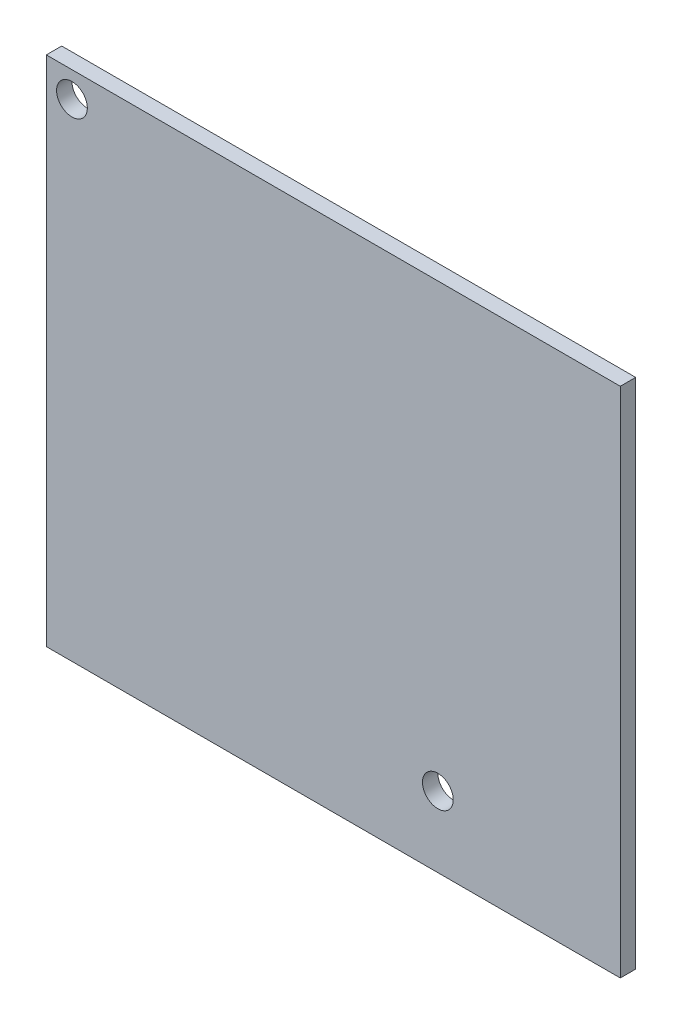
ISO-10303-21;
HEADER;
FILE_DESCRIPTION(('STEP AP214'),'2;1');
FILE_NAME('part.step','',(''),(''),'','','');
FILE_SCHEMA(('AUTOMOTIVE_DESIGN { 1 0 10303 214 1 1 1 1 }'));
ENDSEC;
DATA;
#1=APPLICATION_CONTEXT('core data for automotive mechanical design processes');
#2=APPLICATION_PROTOCOL_DEFINITION('international standard','automotive_design',2000,#1);
#3=PRODUCT_CONTEXT('',#1,'mechanical');
#4=PRODUCT('Part','Part','',(#3));
#5=PRODUCT_RELATED_PRODUCT_CATEGORY('part','',(#4));
#6=PRODUCT_DEFINITION_FORMATION('','',#4);
#7=PRODUCT_DEFINITION_CONTEXT('part definition',#1,'design');
#8=PRODUCT_DEFINITION('design','',#6,#7);
#9=PRODUCT_DEFINITION_SHAPE('','',#8);
#10=(LENGTH_UNIT() NAMED_UNIT(*) SI_UNIT(.MILLI.,.METRE.));
#11=(NAMED_UNIT(*) PLANE_ANGLE_UNIT() SI_UNIT($,.RADIAN.));
#12=(NAMED_UNIT(*) SI_UNIT($,.STERADIAN.) SOLID_ANGLE_UNIT());
#13=UNCERTAINTY_MEASURE_WITH_UNIT(LENGTH_MEASURE(1.E-05),#10,'distance_accuracy_value','');
#14=(GEOMETRIC_REPRESENTATION_CONTEXT(3) GLOBAL_UNCERTAINTY_ASSIGNED_CONTEXT((#13)) GLOBAL_UNIT_ASSIGNED_CONTEXT((#10,
#11,#12)) REPRESENTATION_CONTEXT('',''));
#15=CARTESIAN_POINT('',(0.,0.,0.));
#16=DIRECTION('',(0.,0.,1.));
#17=DIRECTION('',(1.,0.,0.));
#18=AXIS2_PLACEMENT_3D('',#15,#16,#17);
#19=CARTESIAN_POINT('',(28.,25.,1.5));
#20=DIRECTION('',(0.,0.,1.));
#21=DIRECTION('',(1.,0.,0.));
#22=AXIS2_PLACEMENT_3D('',#19,#20,#21);
#23=PLANE('',#22);
#24=CARTESIAN_POINT('',(2.49999999999999,47.5,1.5));
#25=DIRECTION('',(0.,0.,1.));
#26=DIRECTION('',(1.,0.,0.));
#27=AXIS2_PLACEMENT_3D('',#24,#25,#26);
#28=CIRCLE('',#27,1.5);
#29=CARTESIAN_POINT('',(3.99999999999999,47.5,1.5));
#30=VERTEX_POINT('',#29);
#31=EDGE_CURVE('E85',#30,#30,#28,.F.);
#32=ORIENTED_EDGE('',*,*,#31,.T.);
#33=EDGE_LOOP('',(#32));
#34=FACE_BOUND('',#33,.T.);
#35=CARTESIAN_POINT('',(38.2,6.9,1.5));
#36=DIRECTION('',(0.,0.,1.));
#37=DIRECTION('',(1.,0.,0.));
#38=AXIS2_PLACEMENT_3D('',#35,#36,#37);
#39=CIRCLE('',#38,1.5);
#40=CARTESIAN_POINT('',(39.7,6.9,1.5));
#41=VERTEX_POINT('',#40);
#42=EDGE_CURVE('E20',#41,#41,#39,.F.);
#43=ORIENTED_EDGE('',*,*,#42,.T.);
#44=EDGE_LOOP('',(#43));
#45=FACE_BOUND('',#44,.T.);
#46=DIRECTION('',(0.,1.,0.));
#47=VECTOR('',#46,1.);
#48=CARTESIAN_POINT('',(56.,50.,1.5));
#49=LINE('',#48,#47);
#50=CARTESIAN_POINT('',(56.,50.,1.5));
#51=VERTEX_POINT('',#50);
#52=CARTESIAN_POINT('',(56.,0.,1.5));
#53=VERTEX_POINT('',#52);
#54=EDGE_CURVE('E68',#51,#53,#49,.F.);
#55=ORIENTED_EDGE('',*,*,#54,.F.);
#56=DIRECTION('',(1.,0.,0.));
#57=VECTOR('',#56,1.);
#58=CARTESIAN_POINT('',(0.,50.,1.5));
#59=LINE('',#58,#57);
#60=CARTESIAN_POINT('',(0.,50.,1.5));
#61=VERTEX_POINT('',#60);
#62=EDGE_CURVE('E59',#61,#51,#59,.T.);
#63=ORIENTED_EDGE('',*,*,#62,.F.);
#64=DIRECTION('',(0.,1.,0.));
#65=VECTOR('',#64,1.);
#66=CARTESIAN_POINT('',(0.,0.,1.5));
#67=LINE('',#66,#65);
#68=CARTESIAN_POINT('',(0.,0.,1.5));
#69=VERTEX_POINT('',#68);
#70=EDGE_CURVE('E54',#69,#61,#67,.T.);
#71=ORIENTED_EDGE('',*,*,#70,.F.);
#72=DIRECTION('',(1.,0.,0.));
#73=VECTOR('',#72,1.);
#74=CARTESIAN_POINT('',(56.,0.,1.5));
#75=LINE('',#74,#73);
#76=EDGE_CURVE('E71',#53,#69,#75,.F.);
#77=ORIENTED_EDGE('',*,*,#76,.F.);
#78=EDGE_LOOP('',(#55,#63,#71,#77));
#79=FACE_BOUND('',#78,.T.);
#80=ADVANCED_FACE('F17',(#34,#45,#79),#23,.T.);
#81=CARTESIAN_POINT('',(56.,50.,0.));
#82=DIRECTION('',(1.,0.,0.));
#83=DIRECTION('',(0.,0.,-1.));
#84=AXIS2_PLACEMENT_3D('',#81,#82,#83);
#85=PLANE('',#84);
#86=DIRECTION('',(0.,1.,0.));
#87=VECTOR('',#86,1.);
#88=CARTESIAN_POINT('',(56.,25.,0.));
#89=LINE('',#88,#87);
#90=CARTESIAN_POINT('',(56.,0.,0.));
#91=VERTEX_POINT('',#90);
#92=CARTESIAN_POINT('',(56.,50.,0.));
#93=VERTEX_POINT('',#92);
#94=EDGE_CURVE('E78',#91,#93,#89,.T.);
#95=ORIENTED_EDGE('',*,*,#94,.T.);
#96=DIRECTION('',(0.,0.,1.));
#97=VECTOR('',#96,1.);
#98=CARTESIAN_POINT('',(56.,50.,0.));
#99=LINE('',#98,#97);
#100=EDGE_CURVE('E64',#51,#93,#99,.F.);
#101=ORIENTED_EDGE('',*,*,#100,.F.);
#102=ORIENTED_EDGE('',*,*,#54,.T.);
#103=DIRECTION('',(0.,0.,-1.));
#104=VECTOR('',#103,1.);
#105=CARTESIAN_POINT('',(56.,0.,0.));
#106=LINE('',#105,#104);
#107=EDGE_CURVE('E92',#91,#53,#106,.F.);
#108=ORIENTED_EDGE('',*,*,#107,.F.);
#109=EDGE_LOOP('',(#95,#101,#102,#108));
#110=FACE_BOUND('',#109,.T.);
#111=ADVANCED_FACE('F77',(#110),#85,.T.);
#112=CARTESIAN_POINT('',(0.,50.,0.));
#113=DIRECTION('',(0.,1.,0.));
#114=DIRECTION('',(0.,0.,1.));
#115=AXIS2_PLACEMENT_3D('',#112,#113,#114);
#116=PLANE('',#115);
#117=DIRECTION('',(1.,0.,0.));
#118=VECTOR('',#117,1.);
#119=CARTESIAN_POINT('',(28.,50.,0.));
#120=LINE('',#119,#118);
#121=CARTESIAN_POINT('',(0.,50.,0.));
#122=VERTEX_POINT('',#121);
#123=EDGE_CURVE('E89',#93,#122,#120,.F.);
#124=ORIENTED_EDGE('',*,*,#123,.T.);
#125=DIRECTION('',(0.,0.,1.));
#126=VECTOR('',#125,1.);
#127=CARTESIAN_POINT('',(0.,50.,0.));
#128=LINE('',#127,#126);
#129=EDGE_CURVE('E66',#61,#122,#128,.F.);
#130=ORIENTED_EDGE('',*,*,#129,.F.);
#131=ORIENTED_EDGE('',*,*,#62,.T.);
#132=ORIENTED_EDGE('',*,*,#100,.T.);
#133=EDGE_LOOP('',(#124,#130,#131,#132));
#134=FACE_BOUND('',#133,.T.);
#135=ADVANCED_FACE('F62',(#134),#116,.T.);
#136=CARTESIAN_POINT('',(0.,0.,0.));
#137=DIRECTION('',(-1.,0.,0.));
#138=DIRECTION('',(0.,0.,1.));
#139=AXIS2_PLACEMENT_3D('',#136,#137,#138);
#140=PLANE('',#139);
#141=DIRECTION('',(0.,1.,0.));
#142=VECTOR('',#141,1.);
#143=CARTESIAN_POINT('',(0.,25.,0.));
#144=LINE('',#143,#142);
#145=CARTESIAN_POINT('',(0.,0.,0.));
#146=VERTEX_POINT('',#145);
#147=EDGE_CURVE('E102',#122,#146,#144,.F.);
#148=ORIENTED_EDGE('',*,*,#147,.T.);
#149=DIRECTION('',(0.,0.,-1.));
#150=VECTOR('',#149,1.);
#151=CARTESIAN_POINT('',(0.,0.,0.));
#152=LINE('',#151,#150);
#153=EDGE_CURVE('E35',#69,#146,#152,.T.);
#154=ORIENTED_EDGE('',*,*,#153,.F.);
#155=ORIENTED_EDGE('',*,*,#70,.T.);
#156=ORIENTED_EDGE('',*,*,#129,.T.);
#157=EDGE_LOOP('',(#148,#154,#155,#156));
#158=FACE_BOUND('',#157,.T.);
#159=ADVANCED_FACE('F101',(#158),#140,.T.);
#160=CARTESIAN_POINT('',(56.,0.,0.));
#161=DIRECTION('',(0.,-1.,0.));
#162=DIRECTION('',(0.,0.,-1.));
#163=AXIS2_PLACEMENT_3D('',#160,#161,#162);
#164=PLANE('',#163);
#165=DIRECTION('',(1.,0.,0.));
#166=VECTOR('',#165,1.);
#167=CARTESIAN_POINT('',(28.,0.,0.));
#168=LINE('',#167,#166);
#169=EDGE_CURVE('E84',#146,#91,#168,.T.);
#170=ORIENTED_EDGE('',*,*,#169,.T.);
#171=ORIENTED_EDGE('',*,*,#107,.T.);
#172=ORIENTED_EDGE('',*,*,#76,.T.);
#173=ORIENTED_EDGE('',*,*,#153,.T.);
#174=EDGE_LOOP('',(#170,#171,#172,#173));
#175=FACE_BOUND('',#174,.T.);
#176=ADVANCED_FACE('F107',(#175),#164,.T.);
#177=CARTESIAN_POINT('',(38.2,6.9,-73.588281375991));
#178=DIRECTION('',(0.,0.,1.));
#179=DIRECTION('',(1.,0.,0.));
#180=AXIS2_PLACEMENT_3D('',#177,#178,#179);
#181=CYLINDRICAL_SURFACE('',#180,1.5);
#182=ORIENTED_EDGE('',*,*,#42,.F.);
#183=EDGE_LOOP('',(#182));
#184=FACE_BOUND('',#183,.T.);
#185=CARTESIAN_POINT('',(38.2,6.9,0.));
#186=DIRECTION('',(0.,0.,1.));
#187=DIRECTION('',(1.,0.,0.));
#188=AXIS2_PLACEMENT_3D('',#185,#186,#187);
#189=CIRCLE('',#188,1.5);
#190=CARTESIAN_POINT('',(39.7,6.9,0.));
#191=VERTEX_POINT('',#190);
#192=EDGE_CURVE('E26',#191,#191,#189,.F.);
#193=ORIENTED_EDGE('',*,*,#192,.T.);
#194=EDGE_LOOP('',(#193));
#195=FACE_BOUND('',#194,.T.);
#196=ADVANCED_FACE('F109',(#184,#195),#181,.F.);
#197=CARTESIAN_POINT('',(2.49999999999999,47.5,-73.588281375991));
#198=DIRECTION('',(0.,0.,1.));
#199=DIRECTION('',(1.,0.,0.));
#200=AXIS2_PLACEMENT_3D('',#197,#198,#199);
#201=CYLINDRICAL_SURFACE('',#200,1.5);
#202=ORIENTED_EDGE('',*,*,#31,.F.);
#203=EDGE_LOOP('',(#202));
#204=FACE_BOUND('',#203,.T.);
#205=CARTESIAN_POINT('',(2.49999999999999,47.5,0.));
#206=DIRECTION('',(0.,0.,1.));
#207=DIRECTION('',(1.,0.,0.));
#208=AXIS2_PLACEMENT_3D('',#205,#206,#207);
#209=CIRCLE('',#208,1.5);
#210=CARTESIAN_POINT('',(3.99999999999999,47.5,0.));
#211=VERTEX_POINT('',#210);
#212=EDGE_CURVE('E11',#211,#211,#209,.F.);
#213=ORIENTED_EDGE('',*,*,#212,.T.);
#214=EDGE_LOOP('',(#213));
#215=FACE_BOUND('',#214,.T.);
#216=ADVANCED_FACE('F116',(#204,#215),#201,.F.);
#217=CARTESIAN_POINT('',(28.,25.,0.));
#218=DIRECTION('',(0.,0.,1.));
#219=DIRECTION('',(1.,0.,0.));
#220=AXIS2_PLACEMENT_3D('',#217,#218,#219);
#221=PLANE('',#220);
#222=ORIENTED_EDGE('',*,*,#212,.F.);
#223=EDGE_LOOP('',(#222));
#224=FACE_BOUND('',#223,.T.);
#225=ORIENTED_EDGE('',*,*,#192,.F.);
#226=EDGE_LOOP('',(#225));
#227=FACE_BOUND('',#226,.T.);
#228=ORIENTED_EDGE('',*,*,#147,.F.);
#229=ORIENTED_EDGE('',*,*,#123,.F.);
#230=ORIENTED_EDGE('',*,*,#94,.F.);
#231=ORIENTED_EDGE('',*,*,#169,.F.);
#232=EDGE_LOOP('',(#228,#229,#230,#231));
#233=FACE_BOUND('',#232,.T.);
#234=ADVANCED_FACE('F104',(#224,#227,#233),#221,.F.);
#235=CLOSED_SHELL('',(#80,#111,#135,#159,#176,#196,#216,#234));
#236=MANIFOLD_SOLID_BREP('B1',#235);
#237=ADVANCED_BREP_SHAPE_REPRESENTATION('',(#18,#236),#14);
#238=SHAPE_DEFINITION_REPRESENTATION(#9,#237);
ENDSEC;
END-ISO-10303-21;
